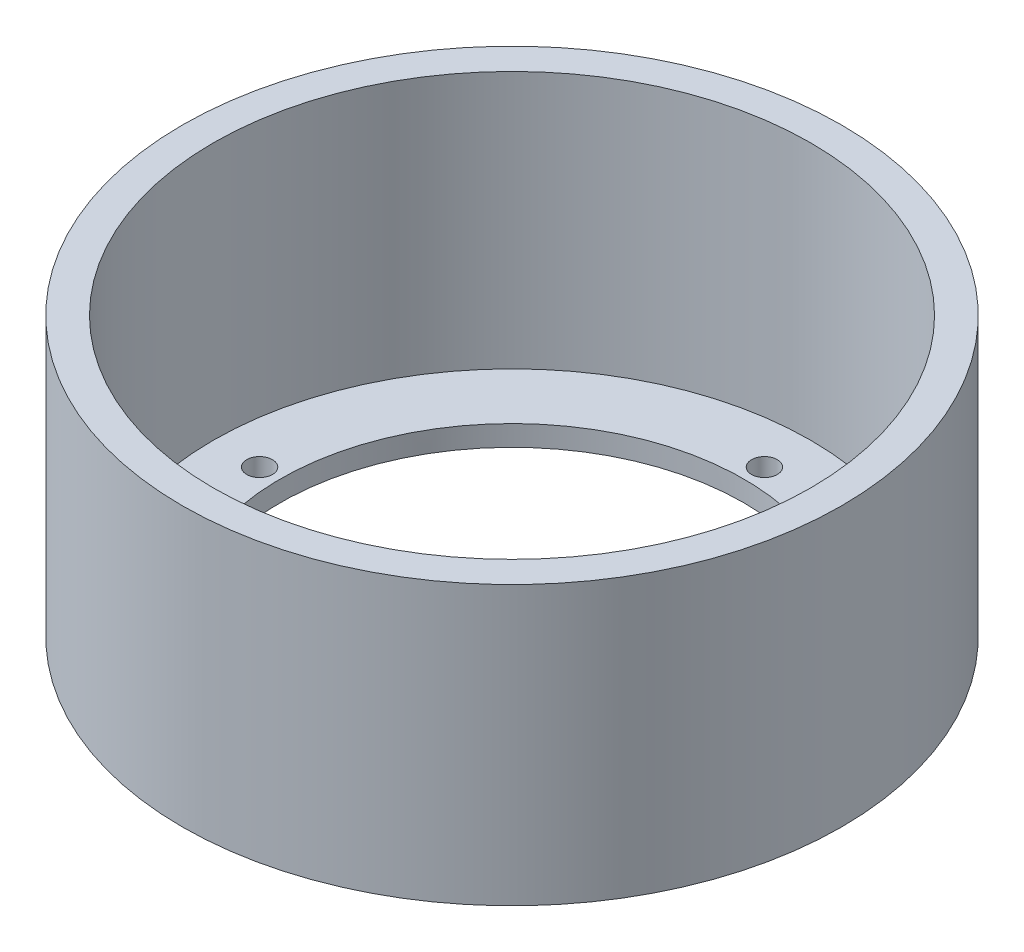
ISO-10303-21;
HEADER;
FILE_DESCRIPTION(('STEP AP214'),'2;1');
FILE_NAME('part.step','',(''),(''),'','','');
FILE_SCHEMA(('AUTOMOTIVE_DESIGN { 1 0 10303 214 1 1 1 1 }'));
ENDSEC;
DATA;
#1=APPLICATION_CONTEXT('core data for automotive mechanical design processes');
#2=APPLICATION_PROTOCOL_DEFINITION('international standard','automotive_design',2000,#1);
#3=PRODUCT_CONTEXT('',#1,'mechanical');
#4=PRODUCT('Part','Part','',(#3));
#5=PRODUCT_RELATED_PRODUCT_CATEGORY('part','',(#4));
#6=PRODUCT_DEFINITION_FORMATION('','',#4);
#7=PRODUCT_DEFINITION_CONTEXT('part definition',#1,'design');
#8=PRODUCT_DEFINITION('design','',#6,#7);
#9=PRODUCT_DEFINITION_SHAPE('','',#8);
#10=(LENGTH_UNIT() NAMED_UNIT(*) SI_UNIT(.MILLI.,.METRE.));
#11=(NAMED_UNIT(*) PLANE_ANGLE_UNIT() SI_UNIT($,.RADIAN.));
#12=(NAMED_UNIT(*) SI_UNIT($,.STERADIAN.) SOLID_ANGLE_UNIT());
#13=UNCERTAINTY_MEASURE_WITH_UNIT(LENGTH_MEASURE(1.E-05),#10,'distance_accuracy_value','');
#14=(GEOMETRIC_REPRESENTATION_CONTEXT(3) GLOBAL_UNCERTAINTY_ASSIGNED_CONTEXT((#13)) GLOBAL_UNIT_ASSIGNED_CONTEXT((#10,
#11,#12)) REPRESENTATION_CONTEXT('',''));
#15=CARTESIAN_POINT('',(0.,0.,0.));
#16=DIRECTION('',(0.,0.,1.));
#17=DIRECTION('',(1.,0.,0.));
#18=AXIS2_PLACEMENT_3D('',#15,#16,#17);
#19=CARTESIAN_POINT('',(0.,0.,0.));
#20=DIRECTION('',(0.,1.,0.));
#21=DIRECTION('',(0.,0.,1.));
#22=AXIS2_PLACEMENT_3D('',#19,#20,#21);
#23=CYLINDRICAL_SURFACE('',#22,22.5);
#24=CARTESIAN_POINT('',(0.,0.,0.));
#25=DIRECTION('',(0.,-1.,0.));
#26=DIRECTION('',(0.,0.,-1.));
#27=AXIS2_PLACEMENT_3D('',#24,#25,#26);
#28=CIRCLE('',#27,22.5);
#29=CARTESIAN_POINT('',(0.,0.,-22.5));
#30=VERTEX_POINT('',#29);
#31=EDGE_CURVE('E53',#30,#30,#28,.T.);
#32=ORIENTED_EDGE('',*,*,#31,.T.);
#33=EDGE_LOOP('',(#32));
#34=FACE_BOUND('',#33,.T.);
#35=CARTESIAN_POINT('',(0.,2.,0.));
#36=DIRECTION('',(0.,1.,0.));
#37=DIRECTION('',(0.,0.,1.));
#38=AXIS2_PLACEMENT_3D('',#35,#36,#37);
#39=CIRCLE('',#38,22.5);
#40=CARTESIAN_POINT('',(0.,2.,22.5));
#41=VERTEX_POINT('',#40);
#42=EDGE_CURVE('E44',#41,#41,#39,.T.);
#43=ORIENTED_EDGE('',*,*,#42,.T.);
#44=EDGE_LOOP('',(#43));
#45=FACE_BOUND('',#44,.T.);
#46=ADVANCED_FACE('F40',(#34,#45),#23,.F.);
#47=CARTESIAN_POINT('',(0.,27.,0.));
#48=DIRECTION('',(0.,-1.,0.));
#49=DIRECTION('',(0.,0.,-1.));
#50=AXIS2_PLACEMENT_3D('',#47,#48,#49);
#51=CYLINDRICAL_SURFACE('',#50,32.);
#52=CARTESIAN_POINT('',(0.,27.,0.));
#53=DIRECTION('',(0.,1.,0.));
#54=DIRECTION('',(0.,0.,1.));
#55=AXIS2_PLACEMENT_3D('',#52,#53,#54);
#56=CIRCLE('',#55,32.);
#57=CARTESIAN_POINT('',(0.,27.,32.));
#58=VERTEX_POINT('',#57);
#59=EDGE_CURVE('E10',#58,#58,#56,.T.);
#60=ORIENTED_EDGE('',*,*,#59,.F.);
#61=EDGE_LOOP('',(#60));
#62=FACE_BOUND('',#61,.T.);
#63=CARTESIAN_POINT('',(0.,0.,0.));
#64=DIRECTION('',(0.,1.,0.));
#65=DIRECTION('',(0.,0.,1.));
#66=AXIS2_PLACEMENT_3D('',#63,#64,#65);
#67=CIRCLE('',#66,32.);
#68=CARTESIAN_POINT('',(0.,0.,32.));
#69=VERTEX_POINT('',#68);
#70=EDGE_CURVE('E48',#69,#69,#67,.T.);
#71=ORIENTED_EDGE('',*,*,#70,.T.);
#72=EDGE_LOOP('',(#71));
#73=FACE_BOUND('',#72,.T.);
#74=ADVANCED_FACE('F42',(#62,#73),#51,.T.);
#75=CARTESIAN_POINT('',(0.,27.,0.));
#76=DIRECTION('',(0.,1.,0.));
#77=DIRECTION('',(0.,0.,1.));
#78=AXIS2_PLACEMENT_3D('',#75,#76,#77);
#79=PLANE('',#78);
#80=CARTESIAN_POINT('',(0.,27.,0.));
#81=DIRECTION('',(0.,1.,0.));
#82=DIRECTION('',(0.,0.,1.));
#83=AXIS2_PLACEMENT_3D('',#80,#81,#82);
#84=CIRCLE('',#83,29.);
#85=CARTESIAN_POINT('',(0.,27.,29.));
#86=VERTEX_POINT('',#85);
#87=EDGE_CURVE('E57',#86,#86,#84,.T.);
#88=ORIENTED_EDGE('',*,*,#87,.F.);
#89=EDGE_LOOP('',(#88));
#90=FACE_BOUND('',#89,.T.);
#91=ORIENTED_EDGE('',*,*,#59,.T.);
#92=EDGE_LOOP('',(#91));
#93=FACE_BOUND('',#92,.T.);
#94=ADVANCED_FACE('F94',(#90,#93),#79,.T.);
#95=CARTESIAN_POINT('',(0.,0.,0.));
#96=DIRECTION('',(0.,1.,0.));
#97=DIRECTION('',(0.,0.,1.));
#98=AXIS2_PLACEMENT_3D('',#95,#96,#97);
#99=PLANE('',#98);
#100=CARTESIAN_POINT('',(-24.5,0.,0.));
#101=DIRECTION('',(0.,-1.,0.));
#102=DIRECTION('',(0.,0.,-1.));
#103=AXIS2_PLACEMENT_3D('',#100,#101,#102);
#104=CIRCLE('',#103,1.25);
#105=CARTESIAN_POINT('',(-24.5,0.,-1.25000000000009));
#106=VERTEX_POINT('',#105);
#107=EDGE_CURVE('E84',#106,#106,#104,.T.);
#108=ORIENTED_EDGE('',*,*,#107,.F.);
#109=EDGE_LOOP('',(#108));
#110=FACE_BOUND('',#109,.T.);
#111=CARTESIAN_POINT('',(0.,0.,-24.5));
#112=DIRECTION('',(0.,-1.,0.));
#113=DIRECTION('',(0.,0.,-1.));
#114=AXIS2_PLACEMENT_3D('',#111,#112,#113);
#115=CIRCLE('',#114,1.25);
#116=CARTESIAN_POINT('',(0.,0.,-25.75));
#117=VERTEX_POINT('',#116);
#118=EDGE_CURVE('E78',#117,#117,#115,.T.);
#119=ORIENTED_EDGE('',*,*,#118,.F.);
#120=EDGE_LOOP('',(#119));
#121=FACE_BOUND('',#120,.T.);
#122=CARTESIAN_POINT('',(24.5,0.,0.));
#123=DIRECTION('',(0.,-1.,0.));
#124=DIRECTION('',(0.,0.,-1.));
#125=AXIS2_PLACEMENT_3D('',#122,#123,#124);
#126=CIRCLE('',#125,1.25);
#127=CARTESIAN_POINT('',(24.5,0.,-1.2499999999999));
#128=VERTEX_POINT('',#127);
#129=EDGE_CURVE('E72',#128,#128,#126,.T.);
#130=ORIENTED_EDGE('',*,*,#129,.F.);
#131=EDGE_LOOP('',(#130));
#132=FACE_BOUND('',#131,.T.);
#133=CARTESIAN_POINT('',(0.,0.,24.5));
#134=DIRECTION('',(0.,-1.,0.));
#135=DIRECTION('',(0.,0.,-1.));
#136=AXIS2_PLACEMENT_3D('',#133,#134,#135);
#137=CIRCLE('',#136,1.25);
#138=CARTESIAN_POINT('',(0.,0.,23.25));
#139=VERTEX_POINT('',#138);
#140=EDGE_CURVE('E66',#139,#139,#137,.T.);
#141=ORIENTED_EDGE('',*,*,#140,.F.);
#142=EDGE_LOOP('',(#141));
#143=FACE_BOUND('',#142,.T.);
#144=ORIENTED_EDGE('',*,*,#31,.F.);
#145=EDGE_LOOP('',(#144));
#146=FACE_BOUND('',#145,.T.);
#147=ORIENTED_EDGE('',*,*,#70,.F.);
#148=EDGE_LOOP('',(#147));
#149=FACE_BOUND('',#148,.T.);
#150=ADVANCED_FACE('F90',(#110,#121,#132,#143,#146,#149),#99,.F.);
#151=CARTESIAN_POINT('',(0.,2.,0.));
#152=DIRECTION('',(0.,1.,0.));
#153=DIRECTION('',(0.,0.,1.));
#154=AXIS2_PLACEMENT_3D('',#151,#152,#153);
#155=CYLINDRICAL_SURFACE('',#154,29.);
#156=CARTESIAN_POINT('',(0.,2.,0.));
#157=DIRECTION('',(0.,1.,0.));
#158=DIRECTION('',(0.,0.,1.));
#159=AXIS2_PLACEMENT_3D('',#156,#157,#158);
#160=CIRCLE('',#159,29.);
#161=CARTESIAN_POINT('',(0.,2.,29.));
#162=VERTEX_POINT('',#161);
#163=EDGE_CURVE('E60',#162,#162,#160,.T.);
#164=ORIENTED_EDGE('',*,*,#163,.F.);
#165=EDGE_LOOP('',(#164));
#166=FACE_BOUND('',#165,.T.);
#167=ORIENTED_EDGE('',*,*,#87,.T.);
#168=EDGE_LOOP('',(#167));
#169=FACE_BOUND('',#168,.T.);
#170=ADVANCED_FACE('F93',(#166,#169),#155,.F.);
#171=CARTESIAN_POINT('',(0.,2.,0.));
#172=DIRECTION('',(0.,1.,0.));
#173=DIRECTION('',(0.,0.,1.));
#174=AXIS2_PLACEMENT_3D('',#171,#172,#173);
#175=PLANE('',#174);
#176=CARTESIAN_POINT('',(-24.5,2.,0.));
#177=DIRECTION('',(0.,1.,0.));
#178=DIRECTION('',(0.,0.,1.));
#179=AXIS2_PLACEMENT_3D('',#176,#177,#178);
#180=CIRCLE('',#179,1.25);
#181=CARTESIAN_POINT('',(-24.5,2.,1.2499999999999));
#182=VERTEX_POINT('',#181);
#183=EDGE_CURVE('E81',#182,#182,#180,.T.);
#184=ORIENTED_EDGE('',*,*,#183,.F.);
#185=EDGE_LOOP('',(#184));
#186=FACE_BOUND('',#185,.T.);
#187=CARTESIAN_POINT('',(0.,2.,-24.5));
#188=DIRECTION('',(0.,1.,0.));
#189=DIRECTION('',(0.,0.,1.));
#190=AXIS2_PLACEMENT_3D('',#187,#188,#189);
#191=CIRCLE('',#190,1.25);
#192=CARTESIAN_POINT('',(0.,2.,-23.25));
#193=VERTEX_POINT('',#192);
#194=EDGE_CURVE('E75',#193,#193,#191,.T.);
#195=ORIENTED_EDGE('',*,*,#194,.F.);
#196=EDGE_LOOP('',(#195));
#197=FACE_BOUND('',#196,.T.);
#198=CARTESIAN_POINT('',(24.5,2.,0.));
#199=DIRECTION('',(0.,1.,0.));
#200=DIRECTION('',(0.,0.,1.));
#201=AXIS2_PLACEMENT_3D('',#198,#199,#200);
#202=CIRCLE('',#201,1.25);
#203=CARTESIAN_POINT('',(24.5,2.,1.25000000000009));
#204=VERTEX_POINT('',#203);
#205=EDGE_CURVE('E69',#204,#204,#202,.T.);
#206=ORIENTED_EDGE('',*,*,#205,.F.);
#207=EDGE_LOOP('',(#206));
#208=FACE_BOUND('',#207,.T.);
#209=CARTESIAN_POINT('',(0.,2.,24.5));
#210=DIRECTION('',(0.,1.,0.));
#211=DIRECTION('',(0.,0.,1.));
#212=AXIS2_PLACEMENT_3D('',#209,#210,#211);
#213=CIRCLE('',#212,1.25);
#214=CARTESIAN_POINT('',(0.,2.,25.75));
#215=VERTEX_POINT('',#214);
#216=EDGE_CURVE('E61',#215,#215,#213,.T.);
#217=ORIENTED_EDGE('',*,*,#216,.F.);
#218=EDGE_LOOP('',(#217));
#219=FACE_BOUND('',#218,.T.);
#220=ORIENTED_EDGE('',*,*,#42,.F.);
#221=EDGE_LOOP('',(#220));
#222=FACE_BOUND('',#221,.T.);
#223=ORIENTED_EDGE('',*,*,#163,.T.);
#224=EDGE_LOOP('',(#223));
#225=FACE_BOUND('',#224,.T.);
#226=ADVANCED_FACE('F121',(#186,#197,#208,#219,#222,#225),#175,.T.);
#227=CARTESIAN_POINT('',(0.,0.,24.5));
#228=DIRECTION('',(0.,-1.,0.));
#229=DIRECTION('',(0.,0.,-1.));
#230=AXIS2_PLACEMENT_3D('',#227,#228,#229);
#231=CYLINDRICAL_SURFACE('',#230,1.25);
#232=ORIENTED_EDGE('',*,*,#216,.T.);
#233=EDGE_LOOP('',(#232));
#234=FACE_BOUND('',#233,.T.);
#235=ORIENTED_EDGE('',*,*,#140,.T.);
#236=EDGE_LOOP('',(#235));
#237=FACE_BOUND('',#236,.T.);
#238=ADVANCED_FACE('F125',(#234,#237),#231,.F.);
#239=CARTESIAN_POINT('',(24.5,0.,0.));
#240=DIRECTION('',(0.,-1.,0.));
#241=DIRECTION('',(0.,0.,-1.));
#242=AXIS2_PLACEMENT_3D('',#239,#240,#241);
#243=CYLINDRICAL_SURFACE('',#242,1.25);
#244=ORIENTED_EDGE('',*,*,#205,.T.);
#245=EDGE_LOOP('',(#244));
#246=FACE_BOUND('',#245,.T.);
#247=ORIENTED_EDGE('',*,*,#129,.T.);
#248=EDGE_LOOP('',(#247));
#249=FACE_BOUND('',#248,.T.);
#250=ADVANCED_FACE('F129',(#246,#249),#243,.F.);
#251=CARTESIAN_POINT('',(0.,0.,-24.5));
#252=DIRECTION('',(0.,-1.,0.));
#253=DIRECTION('',(0.,0.,-1.));
#254=AXIS2_PLACEMENT_3D('',#251,#252,#253);
#255=CYLINDRICAL_SURFACE('',#254,1.25);
#256=ORIENTED_EDGE('',*,*,#194,.T.);
#257=EDGE_LOOP('',(#256));
#258=FACE_BOUND('',#257,.T.);
#259=ORIENTED_EDGE('',*,*,#118,.T.);
#260=EDGE_LOOP('',(#259));
#261=FACE_BOUND('',#260,.T.);
#262=ADVANCED_FACE('F133',(#258,#261),#255,.F.);
#263=CARTESIAN_POINT('',(-24.5,0.,0.));
#264=DIRECTION('',(0.,-1.,0.));
#265=DIRECTION('',(0.,0.,-1.));
#266=AXIS2_PLACEMENT_3D('',#263,#264,#265);
#267=CYLINDRICAL_SURFACE('',#266,1.25);
#268=ORIENTED_EDGE('',*,*,#183,.T.);
#269=EDGE_LOOP('',(#268));
#270=FACE_BOUND('',#269,.T.);
#271=ORIENTED_EDGE('',*,*,#107,.T.);
#272=EDGE_LOOP('',(#271));
#273=FACE_BOUND('',#272,.T.);
#274=ADVANCED_FACE('F88',(#270,#273),#267,.F.);
#275=CLOSED_SHELL('',(#46,#74,#94,#150,#170,#226,#238,#250,#262,#274));
#276=MANIFOLD_SOLID_BREP('B2',#275);
#277=ADVANCED_BREP_SHAPE_REPRESENTATION('',(#18,#276),#14);
#278=SHAPE_DEFINITION_REPRESENTATION(#9,#277);
ENDSEC;
END-ISO-10303-21;
